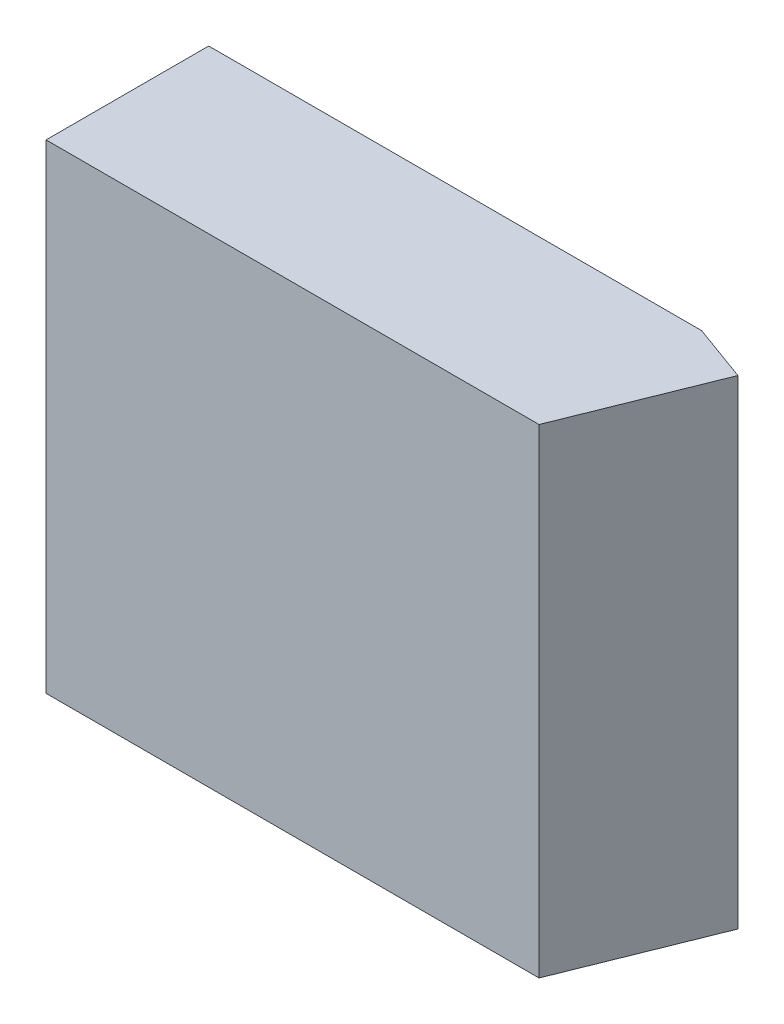
ISO-10303-21;
HEADER;
FILE_DESCRIPTION(('STEP AP214'),'2;1');
FILE_NAME('part.step','',(''),(''),'','','');
FILE_SCHEMA(('AUTOMOTIVE_DESIGN { 1 0 10303 214 1 1 1 1 }'));
ENDSEC;
DATA;
#1=APPLICATION_CONTEXT('core data for automotive mechanical design processes');
#2=APPLICATION_PROTOCOL_DEFINITION('international standard','automotive_design',2000,#1);
#3=PRODUCT_CONTEXT('',#1,'mechanical');
#4=PRODUCT('Part','Part','',(#3));
#5=PRODUCT_RELATED_PRODUCT_CATEGORY('part','',(#4));
#6=PRODUCT_DEFINITION_FORMATION('','',#4);
#7=PRODUCT_DEFINITION_CONTEXT('part definition',#1,'design');
#8=PRODUCT_DEFINITION('design','',#6,#7);
#9=PRODUCT_DEFINITION_SHAPE('','',#8);
#10=(LENGTH_UNIT() NAMED_UNIT(*) SI_UNIT(.MILLI.,.METRE.));
#11=(NAMED_UNIT(*) PLANE_ANGLE_UNIT() SI_UNIT($,.RADIAN.));
#12=(NAMED_UNIT(*) SI_UNIT($,.STERADIAN.) SOLID_ANGLE_UNIT());
#13=UNCERTAINTY_MEASURE_WITH_UNIT(LENGTH_MEASURE(1.E-05),#10,'distance_accuracy_value','');
#14=(GEOMETRIC_REPRESENTATION_CONTEXT(3) GLOBAL_UNCERTAINTY_ASSIGNED_CONTEXT((#13)) GLOBAL_UNIT_ASSIGNED_CONTEXT((#10,
#11,#12)) REPRESENTATION_CONTEXT('',''));
#15=CARTESIAN_POINT('',(0.,0.,0.));
#16=DIRECTION('',(0.,0.,1.));
#17=DIRECTION('',(1.,0.,0.));
#18=AXIS2_PLACEMENT_3D('',#15,#16,#17);
#19=CARTESIAN_POINT('',(-243.84,474.18,160.86));
#20=DIRECTION('',(1.,0.,0.));
#21=DIRECTION('',(0.,0.,-1.));
#22=AXIS2_PLACEMENT_3D('',#19,#20,#21);
#23=PLANE('',#22);
#24=DIRECTION('',(0.,0.,1.));
#25=VECTOR('',#24,1.);
#26=CARTESIAN_POINT('',(-243.84,0.,160.86));
#27=LINE('',#26,#25);
#28=CARTESIAN_POINT('',(-243.84,0.,0.));
#29=VERTEX_POINT('',#28);
#30=CARTESIAN_POINT('',(-243.84,0.,160.86));
#31=VERTEX_POINT('',#30);
#32=EDGE_CURVE('E130',#29,#31,#27,.T.);
#33=ORIENTED_EDGE('',*,*,#32,.T.);
#34=DIRECTION('',(0.,-1.,0.));
#35=VECTOR('',#34,1.);
#36=CARTESIAN_POINT('',(-243.84,474.18,160.86));
#37=LINE('',#36,#35);
#38=CARTESIAN_POINT('',(-243.84,474.18,160.86));
#39=VERTEX_POINT('',#38);
#40=EDGE_CURVE('E11',#39,#31,#37,.T.);
#41=ORIENTED_EDGE('',*,*,#40,.F.);
#42=DIRECTION('',(0.,0.,1.));
#43=VECTOR('',#42,1.);
#44=CARTESIAN_POINT('',(-243.84,474.18,160.86));
#45=LINE('',#44,#43);
#46=CARTESIAN_POINT('',(-243.84,474.18,0.));
#47=VERTEX_POINT('',#46);
#48=EDGE_CURVE('E143',#47,#39,#45,.T.);
#49=ORIENTED_EDGE('',*,*,#48,.F.);
#50=DIRECTION('',(0.,-1.,0.));
#51=VECTOR('',#50,1.);
#52=CARTESIAN_POINT('',(-243.84,474.18,0.));
#53=LINE('',#52,#51);
#54=EDGE_CURVE('E126',#47,#29,#53,.T.);
#55=ORIENTED_EDGE('',*,*,#54,.T.);
#56=EDGE_LOOP('',(#33,#41,#49,#55));
#57=FACE_BOUND('',#56,.T.);
#58=ADVANCED_FACE('F49',(#57),#23,.F.);
#59=CARTESIAN_POINT('',(243.84,474.18,160.86));
#60=DIRECTION('',(0.,0.,-1.));
#61=DIRECTION('',(-1.,0.,0.));
#62=AXIS2_PLACEMENT_3D('',#59,#60,#61);
#63=PLANE('',#62);
#64=DIRECTION('',(1.,0.,0.));
#65=VECTOR('',#64,1.);
#66=CARTESIAN_POINT('',(243.84,0.,160.86));
#67=LINE('',#66,#65);
#68=CARTESIAN_POINT('',(243.84,0.,160.86));
#69=VERTEX_POINT('',#68);
#70=EDGE_CURVE('E134',#31,#69,#67,.T.);
#71=ORIENTED_EDGE('',*,*,#70,.T.);
#72=DIRECTION('',(0.,-1.,0.));
#73=VECTOR('',#72,1.);
#74=CARTESIAN_POINT('',(243.84,474.18,160.86));
#75=LINE('',#74,#73);
#76=CARTESIAN_POINT('',(243.84,474.18,160.86));
#77=VERTEX_POINT('',#76);
#78=EDGE_CURVE('E58',#77,#69,#75,.T.);
#79=ORIENTED_EDGE('',*,*,#78,.F.);
#80=DIRECTION('',(1.,0.,0.));
#81=VECTOR('',#80,1.);
#82=CARTESIAN_POINT('',(243.84,474.18,160.86));
#83=LINE('',#82,#81);
#84=EDGE_CURVE('E101',#39,#77,#83,.T.);
#85=ORIENTED_EDGE('',*,*,#84,.F.);
#86=ORIENTED_EDGE('',*,*,#40,.T.);
#87=EDGE_LOOP('',(#71,#79,#85,#86));
#88=FACE_BOUND('',#87,.T.);
#89=ADVANCED_FACE('F165',(#88),#63,.F.);
#90=CARTESIAN_POINT('',(300.221557247154,474.18,20.5212085995401));
#91=DIRECTION('',(-0.927914662248886,0.,-0.372792676408129));
#92=DIRECTION('',(-0.372792676408129,0.,0.927914662248886));
#93=AXIS2_PLACEMENT_3D('',#90,#91,#92);
#94=PLANE('',#93);
#95=DIRECTION('',(0.372792676408129,0.,-0.927914662248886));
#96=VECTOR('',#95,1.);
#97=CARTESIAN_POINT('',(300.221557247154,0.,20.5212085995401));
#98=LINE('',#97,#96);
#99=CARTESIAN_POINT('',(300.221557247154,0.,20.5212085995401));
#100=VERTEX_POINT('',#99);
#101=EDGE_CURVE('E118',#69,#100,#98,.T.);
#102=ORIENTED_EDGE('',*,*,#101,.T.);
#103=DIRECTION('',(0.,-1.,0.));
#104=VECTOR('',#103,1.);
#105=CARTESIAN_POINT('',(300.221557247154,474.18,20.5212085995401));
#106=LINE('',#105,#104);
#107=CARTESIAN_POINT('',(300.221557247154,474.18,20.5212085995401));
#108=VERTEX_POINT('',#107);
#109=EDGE_CURVE('E115',#108,#100,#106,.T.);
#110=ORIENTED_EDGE('',*,*,#109,.F.);
#111=DIRECTION('',(0.372792676408129,0.,-0.927914662248886));
#112=VECTOR('',#111,1.);
#113=CARTESIAN_POINT('',(300.221557247154,474.18,20.5212085995401));
#114=LINE('',#113,#112);
#115=EDGE_CURVE('E106',#77,#108,#114,.T.);
#116=ORIENTED_EDGE('',*,*,#115,.F.);
#117=ORIENTED_EDGE('',*,*,#78,.T.);
#118=EDGE_LOOP('',(#102,#110,#116,#117));
#119=FACE_BOUND('',#118,.T.);
#120=ADVANCED_FACE('F116',(#119),#94,.F.);
#121=CARTESIAN_POINT('',(243.84,474.18,0.));
#122=DIRECTION('',(-0.342020143325669,0.,0.939692620785908));
#123=DIRECTION('',(0.939692620785909,0.,0.342020143325669));
#124=AXIS2_PLACEMENT_3D('',#121,#122,#123);
#125=PLANE('',#124);
#126=DIRECTION('',(-0.939692620785908,0.,-0.342020143325669));
#127=VECTOR('',#126,1.);
#128=CARTESIAN_POINT('',(243.84,0.,0.));
#129=LINE('',#128,#127);
#130=CARTESIAN_POINT('',(243.84,0.,0.));
#131=VERTEX_POINT('',#130);
#132=EDGE_CURVE('E87',#100,#131,#129,.T.);
#133=ORIENTED_EDGE('',*,*,#132,.T.);
#134=DIRECTION('',(0.,-1.,0.));
#135=VECTOR('',#134,1.);
#136=CARTESIAN_POINT('',(243.84,474.18,0.));
#137=LINE('',#136,#135);
#138=CARTESIAN_POINT('',(243.84,474.18,0.));
#139=VERTEX_POINT('',#138);
#140=EDGE_CURVE('E120',#139,#131,#137,.T.);
#141=ORIENTED_EDGE('',*,*,#140,.F.);
#142=DIRECTION('',(-0.939692620785908,0.,-0.342020143325669));
#143=VECTOR('',#142,1.);
#144=CARTESIAN_POINT('',(243.84,474.18,0.));
#145=LINE('',#144,#143);
#146=EDGE_CURVE('E110',#108,#139,#145,.T.);
#147=ORIENTED_EDGE('',*,*,#146,.F.);
#148=ORIENTED_EDGE('',*,*,#109,.T.);
#149=EDGE_LOOP('',(#133,#141,#147,#148));
#150=FACE_BOUND('',#149,.T.);
#151=ADVANCED_FACE('F122',(#150),#125,.F.);
#152=CARTESIAN_POINT('',(-243.84,474.18,0.));
#153=DIRECTION('',(0.,0.,1.));
#154=DIRECTION('',(1.,0.,0.));
#155=AXIS2_PLACEMENT_3D('',#152,#153,#154);
#156=PLANE('',#155);
#157=DIRECTION('',(-1.,0.,0.));
#158=VECTOR('',#157,1.);
#159=CARTESIAN_POINT('',(-243.84,0.,0.));
#160=LINE('',#159,#158);
#161=EDGE_CURVE('E93',#131,#29,#160,.T.);
#162=ORIENTED_EDGE('',*,*,#161,.T.);
#163=ORIENTED_EDGE('',*,*,#54,.F.);
#164=DIRECTION('',(-1.,0.,0.));
#165=VECTOR('',#164,1.);
#166=CARTESIAN_POINT('',(-243.84,474.18,0.));
#167=LINE('',#166,#165);
#168=EDGE_CURVE('E66',#139,#47,#167,.T.);
#169=ORIENTED_EDGE('',*,*,#168,.F.);
#170=ORIENTED_EDGE('',*,*,#140,.T.);
#171=EDGE_LOOP('',(#162,#163,#169,#170));
#172=FACE_BOUND('',#171,.T.);
#173=ADVANCED_FACE('F154',(#172),#156,.F.);
#174=CARTESIAN_POINT('',(0.,474.18,0.));
#175=DIRECTION('',(0.,-1.,0.));
#176=DIRECTION('',(0.,0.,-1.));
#177=AXIS2_PLACEMENT_3D('',#174,#175,#176);
#178=PLANE('',#177);
#179=ORIENTED_EDGE('',*,*,#48,.T.);
#180=ORIENTED_EDGE('',*,*,#84,.T.);
#181=ORIENTED_EDGE('',*,*,#115,.T.);
#182=ORIENTED_EDGE('',*,*,#146,.T.);
#183=ORIENTED_EDGE('',*,*,#168,.T.);
#184=EDGE_LOOP('',(#179,#180,#181,#182,#183));
#185=FACE_BOUND('',#184,.T.);
#186=ADVANCED_FACE('F108',(#185),#178,.F.);
#187=CARTESIAN_POINT('',(0.,0.,0.));
#188=DIRECTION('',(0.,-1.,0.));
#189=DIRECTION('',(0.,0.,-1.));
#190=AXIS2_PLACEMENT_3D('',#187,#188,#189);
#191=PLANE('',#190);
#192=ORIENTED_EDGE('',*,*,#32,.F.);
#193=ORIENTED_EDGE('',*,*,#161,.F.);
#194=ORIENTED_EDGE('',*,*,#132,.F.);
#195=ORIENTED_EDGE('',*,*,#101,.F.);
#196=ORIENTED_EDGE('',*,*,#70,.F.);
#197=EDGE_LOOP('',(#192,#193,#194,#195,#196));
#198=FACE_BOUND('',#197,.T.);
#199=ADVANCED_FACE('F150',(#198),#191,.T.);
#200=CLOSED_SHELL('',(#58,#89,#120,#151,#173,#186,#199));
#201=MANIFOLD_SOLID_BREP('B2',#200);
#202=ADVANCED_BREP_SHAPE_REPRESENTATION('',(#18,#201),#14);
#203=SHAPE_DEFINITION_REPRESENTATION(#9,#202);
ENDSEC;
END-ISO-10303-21;
